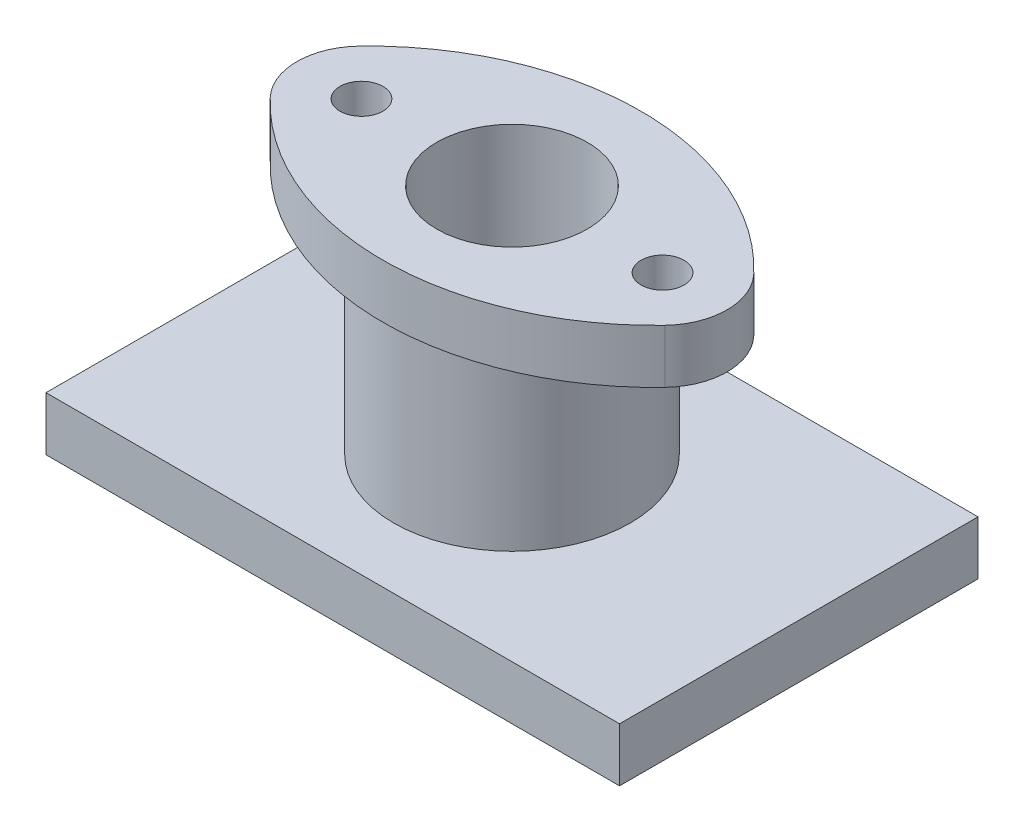
ISO-10303-21;
HEADER;
FILE_DESCRIPTION(('STEP AP214'),'2;1');
FILE_NAME('part.step','',(''),(''),'','','');
FILE_SCHEMA(('AUTOMOTIVE_DESIGN { 1 0 10303 214 1 1 1 1 }'));
ENDSEC;
DATA;
#1=APPLICATION_CONTEXT('core data for automotive mechanical design processes');
#2=APPLICATION_PROTOCOL_DEFINITION('international standard','automotive_design',2000,#1);
#3=PRODUCT_CONTEXT('',#1,'mechanical');
#4=PRODUCT('Part','Part','',(#3));
#5=PRODUCT_RELATED_PRODUCT_CATEGORY('part','',(#4));
#6=PRODUCT_DEFINITION_FORMATION('','',#4);
#7=PRODUCT_DEFINITION_CONTEXT('part definition',#1,'design');
#8=PRODUCT_DEFINITION('design','',#6,#7);
#9=PRODUCT_DEFINITION_SHAPE('','',#8);
#10=(LENGTH_UNIT() NAMED_UNIT(*) SI_UNIT(.MILLI.,.METRE.));
#11=(NAMED_UNIT(*) PLANE_ANGLE_UNIT() SI_UNIT($,.RADIAN.));
#12=(NAMED_UNIT(*) SI_UNIT($,.STERADIAN.) SOLID_ANGLE_UNIT());
#13=UNCERTAINTY_MEASURE_WITH_UNIT(LENGTH_MEASURE(1.E-05),#10,'distance_accuracy_value','');
#14=(GEOMETRIC_REPRESENTATION_CONTEXT(3) GLOBAL_UNCERTAINTY_ASSIGNED_CONTEXT((#13)) GLOBAL_UNIT_ASSIGNED_CONTEXT((#10,
#11,#12)) REPRESENTATION_CONTEXT('',''));
#15=CARTESIAN_POINT('',(0.,0.,0.));
#16=DIRECTION('',(0.,0.,1.));
#17=DIRECTION('',(1.,0.,0.));
#18=AXIS2_PLACEMENT_3D('',#15,#16,#17);
#19=CARTESIAN_POINT('',(80.,15.,-50.));
#20=DIRECTION('',(-1.,0.,0.));
#21=DIRECTION('',(0.,0.,1.));
#22=AXIS2_PLACEMENT_3D('',#19,#20,#21);
#23=PLANE('',#22);
#24=DIRECTION('',(0.,0.,-1.));
#25=VECTOR('',#24,1.);
#26=CARTESIAN_POINT('',(80.,0.,-50.));
#27=LINE('',#26,#25);
#28=CARTESIAN_POINT('',(80.,0.,50.));
#29=VERTEX_POINT('',#28);
#30=CARTESIAN_POINT('',(80.,0.,-50.));
#31=VERTEX_POINT('',#30);
#32=EDGE_CURVE('E152',#29,#31,#27,.T.);
#33=ORIENTED_EDGE('',*,*,#32,.T.);
#34=DIRECTION('',(0.,-1.,0.));
#35=VECTOR('',#34,1.);
#36=CARTESIAN_POINT('',(80.,15.,-50.));
#37=LINE('',#36,#35);
#38=CARTESIAN_POINT('',(80.,15.,-50.));
#39=VERTEX_POINT('',#38);
#40=EDGE_CURVE('E11',#39,#31,#37,.T.);
#41=ORIENTED_EDGE('',*,*,#40,.F.);
#42=DIRECTION('',(0.,0.,-1.));
#43=VECTOR('',#42,1.);
#44=CARTESIAN_POINT('',(80.,15.,-50.));
#45=LINE('',#44,#43);
#46=CARTESIAN_POINT('',(80.,15.,50.));
#47=VERTEX_POINT('',#46);
#48=EDGE_CURVE('E158',#47,#39,#45,.T.);
#49=ORIENTED_EDGE('',*,*,#48,.F.);
#50=DIRECTION('',(0.,-1.,0.));
#51=VECTOR('',#50,1.);
#52=CARTESIAN_POINT('',(80.,15.,50.));
#53=LINE('',#52,#51);
#54=EDGE_CURVE('E164',#47,#29,#53,.T.);
#55=ORIENTED_EDGE('',*,*,#54,.T.);
#56=EDGE_LOOP('',(#33,#41,#49,#55));
#57=FACE_BOUND('',#56,.T.);
#58=ADVANCED_FACE('F38',(#57),#23,.F.);
#59=CARTESIAN_POINT('',(-80.,15.,-50.));
#60=DIRECTION('',(0.,0.,1.));
#61=DIRECTION('',(1.,0.,0.));
#62=AXIS2_PLACEMENT_3D('',#59,#60,#61);
#63=PLANE('',#62);
#64=DIRECTION('',(-1.,0.,0.));
#65=VECTOR('',#64,1.);
#66=CARTESIAN_POINT('',(-80.,0.,-50.));
#67=LINE('',#66,#65);
#68=CARTESIAN_POINT('',(-80.,0.,-50.));
#69=VERTEX_POINT('',#68);
#70=EDGE_CURVE('E167',#31,#69,#67,.T.);
#71=ORIENTED_EDGE('',*,*,#70,.T.);
#72=DIRECTION('',(0.,-1.,0.));
#73=VECTOR('',#72,1.);
#74=CARTESIAN_POINT('',(-80.,15.,-50.));
#75=LINE('',#74,#73);
#76=CARTESIAN_POINT('',(-80.,15.,-50.));
#77=VERTEX_POINT('',#76);
#78=EDGE_CURVE('E46',#77,#69,#75,.T.);
#79=ORIENTED_EDGE('',*,*,#78,.F.);
#80=DIRECTION('',(-1.,0.,0.));
#81=VECTOR('',#80,1.);
#82=CARTESIAN_POINT('',(-80.,15.,-50.));
#83=LINE('',#82,#81);
#84=EDGE_CURVE('E85',#39,#77,#83,.T.);
#85=ORIENTED_EDGE('',*,*,#84,.F.);
#86=ORIENTED_EDGE('',*,*,#40,.T.);
#87=EDGE_LOOP('',(#71,#79,#85,#86));
#88=FACE_BOUND('',#87,.T.);
#89=ADVANCED_FACE('F191',(#88),#63,.F.);
#90=CARTESIAN_POINT('',(-80.,15.,-50.));
#91=DIRECTION('',(1.,0.,0.));
#92=DIRECTION('',(0.,0.,-1.));
#93=AXIS2_PLACEMENT_3D('',#90,#91,#92);
#94=PLANE('',#93);
#95=DIRECTION('',(0.,0.,1.));
#96=VECTOR('',#95,1.);
#97=CARTESIAN_POINT('',(-80.,0.,-50.));
#98=LINE('',#97,#96);
#99=CARTESIAN_POINT('',(-80.,0.,50.));
#100=VERTEX_POINT('',#99);
#101=EDGE_CURVE('E72',#69,#100,#98,.T.);
#102=ORIENTED_EDGE('',*,*,#101,.T.);
#103=DIRECTION('',(0.,-1.,0.));
#104=VECTOR('',#103,1.);
#105=CARTESIAN_POINT('',(-80.,15.,50.));
#106=LINE('',#105,#104);
#107=CARTESIAN_POINT('',(-80.,15.,50.));
#108=VERTEX_POINT('',#107);
#109=EDGE_CURVE('E172',#108,#100,#106,.T.);
#110=ORIENTED_EDGE('',*,*,#109,.F.);
#111=DIRECTION('',(0.,0.,1.));
#112=VECTOR('',#111,1.);
#113=CARTESIAN_POINT('',(-80.,15.,-50.));
#114=LINE('',#113,#112);
#115=EDGE_CURVE('E161',#77,#108,#114,.T.);
#116=ORIENTED_EDGE('',*,*,#115,.F.);
#117=ORIENTED_EDGE('',*,*,#78,.T.);
#118=EDGE_LOOP('',(#102,#110,#116,#117));
#119=FACE_BOUND('',#118,.T.);
#120=ADVANCED_FACE('F174',(#119),#94,.F.);
#121=CARTESIAN_POINT('',(-80.,15.,50.));
#122=DIRECTION('',(0.,0.,-1.));
#123=DIRECTION('',(-1.,0.,0.));
#124=AXIS2_PLACEMENT_3D('',#121,#122,#123);
#125=PLANE('',#124);
#126=DIRECTION('',(1.,0.,0.));
#127=VECTOR('',#126,1.);
#128=CARTESIAN_POINT('',(-80.,0.,50.));
#129=LINE('',#128,#127);
#130=EDGE_CURVE('E78',#100,#29,#129,.T.);
#131=ORIENTED_EDGE('',*,*,#130,.T.);
#132=ORIENTED_EDGE('',*,*,#54,.F.);
#133=DIRECTION('',(1.,0.,0.));
#134=VECTOR('',#133,1.);
#135=CARTESIAN_POINT('',(-80.,15.,50.));
#136=LINE('',#135,#134);
#137=EDGE_CURVE('E54',#108,#47,#136,.T.);
#138=ORIENTED_EDGE('',*,*,#137,.F.);
#139=ORIENTED_EDGE('',*,*,#109,.T.);
#140=EDGE_LOOP('',(#131,#132,#138,#139));
#141=FACE_BOUND('',#140,.T.);
#142=ADVANCED_FACE('F181',(#141),#125,.F.);
#143=CARTESIAN_POINT('',(0.,15.,0.));
#144=DIRECTION('',(0.,1.,0.));
#145=DIRECTION('',(0.,0.,1.));
#146=AXIS2_PLACEMENT_3D('',#143,#144,#145);
#147=PLANE('',#146);
#148=CARTESIAN_POINT('',(0.,15.,0.));
#149=DIRECTION('',(0.,1.,0.));
#150=DIRECTION('',(0.,0.,1.));
#151=AXIS2_PLACEMENT_3D('',#148,#149,#150);
#152=CIRCLE('',#151,33.);
#153=CARTESIAN_POINT('',(0.,15.,33.));
#154=VERTEX_POINT('',#153);
#155=EDGE_CURVE('E138',#154,#154,#152,.T.);
#156=ORIENTED_EDGE('',*,*,#155,.F.);
#157=EDGE_LOOP('',(#156));
#158=FACE_BOUND('',#157,.T.);
#159=ORIENTED_EDGE('',*,*,#48,.T.);
#160=ORIENTED_EDGE('',*,*,#84,.T.);
#161=ORIENTED_EDGE('',*,*,#115,.T.);
#162=ORIENTED_EDGE('',*,*,#137,.T.);
#163=EDGE_LOOP('',(#159,#160,#161,#162));
#164=FACE_BOUND('',#163,.T.);
#165=ADVANCED_FACE('F183',(#158,#164),#147,.T.);
#166=CARTESIAN_POINT('',(0.,0.,0.));
#167=DIRECTION('',(0.,1.,0.));
#168=DIRECTION('',(0.,0.,1.));
#169=AXIS2_PLACEMENT_3D('',#166,#167,#168);
#170=PLANE('',#169);
#171=CARTESIAN_POINT('',(0.,0.,0.));
#172=DIRECTION('',(0.,-1.,0.));
#173=DIRECTION('',(0.,0.,-1.));
#174=AXIS2_PLACEMENT_3D('',#171,#172,#173);
#175=CIRCLE('',#174,16.5);
#176=CARTESIAN_POINT('',(0.,0.,-16.5));
#177=VERTEX_POINT('',#176);
#178=EDGE_CURVE('E148',#177,#177,#175,.T.);
#179=ORIENTED_EDGE('',*,*,#178,.F.);
#180=EDGE_LOOP('',(#179));
#181=FACE_BOUND('',#180,.T.);
#182=ORIENTED_EDGE('',*,*,#32,.F.);
#183=ORIENTED_EDGE('',*,*,#130,.F.);
#184=ORIENTED_EDGE('',*,*,#101,.F.);
#185=ORIENTED_EDGE('',*,*,#70,.F.);
#186=EDGE_LOOP('',(#182,#183,#184,#185));
#187=FACE_BOUND('',#186,.T.);
#188=ADVANCED_FACE('F177',(#181,#187),#170,.F.);
#189=CARTESIAN_POINT('',(0.,61.6690475583121,0.));
#190=DIRECTION('',(0.,-1.,0.));
#191=DIRECTION('',(0.,0.,-1.));
#192=AXIS2_PLACEMENT_3D('',#189,#190,#191);
#193=CYLINDRICAL_SURFACE('',#192,16.5);
#194=CARTESIAN_POINT('',(0.,15.,0.));
#195=DIRECTION('',(0.,1.,0.));
#196=DIRECTION('',(0.,0.,1.));
#197=AXIS2_PLACEMENT_3D('',#194,#195,#196);
#198=CIRCLE('',#197,16.5);
#199=CARTESIAN_POINT('',(0.,15.,-16.5));
#200=VERTEX_POINT('',#199);
#201=EDGE_CURVE('E153',#200,#200,#198,.F.);
#202=CARTESIAN_POINT('',(0.,0.,-16.5));
#203=CARTESIAN_POINT('',(0.,0.156250000000006,-16.5));
#204=CARTESIAN_POINT('',(0.,0.312500000000005,-16.5));
#205=CARTESIAN_POINT('',(0.,0.625000000000005,-16.5));
#206=CARTESIAN_POINT('',(0.,0.781250000000007,-16.5));
#207=CARTESIAN_POINT('',(0.,1.09375000000001,-16.5));
#208=CARTESIAN_POINT('',(0.,1.25000000000001,-16.5));
#209=CARTESIAN_POINT('',(0.,1.56250000000001,-16.5));
#210=CARTESIAN_POINT('',(0.,1.71875000000001,-16.5));
#211=CARTESIAN_POINT('',(0.,2.03125000000001,-16.5));
#212=CARTESIAN_POINT('',(0.,2.18750000000001,-16.5));
#213=CARTESIAN_POINT('',(0.,2.5,-16.5));
#214=CARTESIAN_POINT('',(0.,2.65625,-16.5));
#215=CARTESIAN_POINT('',(0.,2.96875,-16.5));
#216=CARTESIAN_POINT('',(0.,3.125,-16.5));
#217=CARTESIAN_POINT('',(0.,3.43750000000001,-16.5));
#218=CARTESIAN_POINT('',(0.,3.59375,-16.5));
#219=CARTESIAN_POINT('',(0.,3.90625,-16.5));
#220=CARTESIAN_POINT('',(0.,4.0625,-16.5));
#221=CARTESIAN_POINT('',(0.,4.375,-16.5));
#222=CARTESIAN_POINT('',(0.,4.53125,-16.5));
#223=CARTESIAN_POINT('',(0.,4.84375,-16.5));
#224=CARTESIAN_POINT('',(0.,5.,-16.5));
#225=CARTESIAN_POINT('',(0.,5.3125,-16.5));
#226=CARTESIAN_POINT('',(0.,5.46875,-16.5));
#227=CARTESIAN_POINT('',(0.,5.78125,-16.5));
#228=CARTESIAN_POINT('',(0.,5.9375,-16.5));
#229=CARTESIAN_POINT('',(0.,6.25,-16.5));
#230=CARTESIAN_POINT('',(0.,6.40625,-16.5));
#231=CARTESIAN_POINT('',(0.,6.71875,-16.5));
#232=CARTESIAN_POINT('',(0.,6.875,-16.5));
#233=CARTESIAN_POINT('',(0.,7.1875,-16.5));
#234=CARTESIAN_POINT('',(0.,7.34375,-16.5));
#235=CARTESIAN_POINT('',(0.,7.65625,-16.5));
#236=CARTESIAN_POINT('',(0.,7.8125,-16.5));
#237=CARTESIAN_POINT('',(0.,8.125,-16.5));
#238=CARTESIAN_POINT('',(0.,8.28125,-16.5));
#239=CARTESIAN_POINT('',(0.,8.59375,-16.5));
#240=CARTESIAN_POINT('',(0.,8.75,-16.5));
#241=CARTESIAN_POINT('',(0.,9.0625,-16.5));
#242=CARTESIAN_POINT('',(0.,9.21875,-16.5));
#243=CARTESIAN_POINT('',(0.,9.53125,-16.5));
#244=CARTESIAN_POINT('',(0.,9.6875,-16.5));
#245=CARTESIAN_POINT('',(0.,10.,-16.5));
#246=CARTESIAN_POINT('',(0.,10.15625,-16.5));
#247=CARTESIAN_POINT('',(0.,10.46875,-16.5));
#248=CARTESIAN_POINT('',(0.,10.625,-16.5));
#249=CARTESIAN_POINT('',(0.,10.9375,-16.5));
#250=CARTESIAN_POINT('',(0.,11.09375,-16.5));
#251=CARTESIAN_POINT('',(0.,11.40625,-16.5));
#252=CARTESIAN_POINT('',(0.,11.5625,-16.5));
#253=CARTESIAN_POINT('',(0.,11.875,-16.5));
#254=CARTESIAN_POINT('',(0.,12.03125,-16.5));
#255=CARTESIAN_POINT('',(0.,12.34375,-16.5));
#256=CARTESIAN_POINT('',(0.,12.5,-16.5));
#257=CARTESIAN_POINT('',(0.,12.8125,-16.5));
#258=CARTESIAN_POINT('',(0.,12.96875,-16.5));
#259=CARTESIAN_POINT('',(0.,13.28125,-16.5));
#260=CARTESIAN_POINT('',(0.,13.4375,-16.5));
#261=CARTESIAN_POINT('',(0.,13.75,-16.5));
#262=CARTESIAN_POINT('',(0.,13.90625,-16.5));
#263=CARTESIAN_POINT('',(0.,14.21875,-16.5));
#264=CARTESIAN_POINT('',(0.,14.375,-16.5));
#265=CARTESIAN_POINT('',(0.,14.6875,-16.5));
#266=CARTESIAN_POINT('',(0.,14.84375,-16.5));
#267=CARTESIAN_POINT('',(0.,15.,-16.5));
#268=B_SPLINE_CURVE_WITH_KNOTS('',3,(#202,#203,#204,#205,#206,#207,#208,#209,#210,#211,#212,
#213,#214,#215,#216,#217,#218,#219,#220,#221,#222,#223,#224,#225,#226,#227,#228,#229,#230,#231,
#232,#233,#234,#235,#236,#237,#238,#239,#240,#241,#242,#243,#244,#245,#246,#247,#248,#249,#250,
#251,#252,#253,#254,#255,#256,#257,#258,#259,#260,#261,#262,#263,#264,#265,#266,#267),
.UNSPECIFIED.,.F.,.F.,(4,2,2,2,2,2,2,2,2,2,2,2,2,2,2,2,2,2,2,2,2,2,2,2,2,2,2,2,2,2,2,2,4),(0.,
0.468749999999997,0.937500000000001,1.40625,1.875,2.34375,2.8125,3.28125,3.75,4.21874999999999,
4.6875,5.15624999999999,5.62499999999999,6.09374999999999,6.56249999999999,7.03125,
7.49999999999999,7.96875,8.43749999999999,8.90624999999999,9.37499999999999,9.84374999999999,
10.3125,10.78125,11.25,11.71875,12.1875,12.65625,13.125,13.59375,14.0625,14.53125,15.),.UNSPECIFIED.);
#269=EDGE_CURVE('BSEAM218',#177,#200,#268,.T.);
#270=ORIENTED_EDGE('',*,*,#178,.T.);
#271=ORIENTED_EDGE('',*,*,#201,.F.);
#272=ORIENTED_EDGE('',*,*,#269,.T.);
#273=ORIENTED_EDGE('',*,*,#269,.F.);
#274=EDGE_LOOP('',(#270,#272,#271,#273));
#275=FACE_BOUND('',#274,.T.);
#276=ADVANCED_FACE('F218',(#275),#193,.F.);
#277=CARTESIAN_POINT('',(0.,65.,0.));
#278=DIRECTION('',(0.,-1.,0.));
#279=DIRECTION('',(0.,0.,-1.));
#280=AXIS2_PLACEMENT_3D('',#277,#278,#279);
#281=CYLINDRICAL_SURFACE('',#280,33.);
#282=CARTESIAN_POINT('',(0.,65.,0.));
#283=DIRECTION('',(0.,1.,0.));
#284=DIRECTION('',(0.,0.,1.));
#285=AXIS2_PLACEMENT_3D('',#282,#283,#284);
#286=CIRCLE('',#285,33.);
#287=CARTESIAN_POINT('',(0.,65.,33.));
#288=VERTEX_POINT('',#287);
#289=EDGE_CURVE('E141',#288,#288,#286,.T.);
#290=ORIENTED_EDGE('',*,*,#289,.F.);
#291=EDGE_LOOP('',(#290));
#292=FACE_BOUND('',#291,.T.);
#293=ORIENTED_EDGE('',*,*,#155,.T.);
#294=EDGE_LOOP('',(#293));
#295=FACE_BOUND('',#294,.T.);
#296=ADVANCED_FACE('F227',(#292,#295),#281,.T.);
#297=CARTESIAN_POINT('',(21.,80.,20.));
#298=DIRECTION('',(0.,-1.,0.));
#299=DIRECTION('',(0.,0.,-1.));
#300=AXIS2_PLACEMENT_3D('',#297,#298,#299);
#301=PLANE('',#300);
#302=CARTESIAN_POINT('',(0.,80.,0.));
#303=DIRECTION('',(0.,1.,0.));
#304=DIRECTION('',(0.,0.,1.));
#305=AXIS2_PLACEMENT_3D('',#302,#303,#304);
#306=CIRCLE('',#305,21.);
#307=CARTESIAN_POINT('',(0.,80.,21.));
#308=VERTEX_POINT('',#307);
#309=EDGE_CURVE('E346',#308,#308,#306,.T.);
#310=ORIENTED_EDGE('',*,*,#309,.F.);
#311=EDGE_LOOP('',(#310));
#312=FACE_BOUND('',#311,.T.);
#313=CARTESIAN_POINT('',(0.,80.,40.));
#314=DIRECTION('',(0.,1.,0.));
#315=DIRECTION('',(0.,0.,-1.));
#316=AXIS2_PLACEMENT_3D('',#313,#314,#315);
#317=CIRCLE('',#316,76.);
#318=CARTESIAN_POINT('',(55.0344827586207,80.,-12.4137931034483));
#319=VERTEX_POINT('',#318);
#320=CARTESIAN_POINT('',(-55.0344827586207,80.,-12.4137931034483));
#321=VERTEX_POINT('',#320);
#322=EDGE_CURVE('E123',#319,#321,#317,.T.);
#323=ORIENTED_EDGE('',*,*,#322,.T.);
#324=CARTESIAN_POINT('',(-42.,80.,0.));
#325=DIRECTION('',(0.,1.,0.));
#326=DIRECTION('',(0.,0.,1.));
#327=AXIS2_PLACEMENT_3D('',#324,#325,#326);
#328=CIRCLE('',#327,18.);
#329=CARTESIAN_POINT('',(-55.0344827586207,80.,12.4137931034483));
#330=VERTEX_POINT('',#329);
#331=EDGE_CURVE('E112',#321,#330,#328,.T.);
#332=ORIENTED_EDGE('',*,*,#331,.T.);
#333=CARTESIAN_POINT('',(0.,80.,-40.));
#334=DIRECTION('',(0.,1.,0.));
#335=DIRECTION('',(0.,0.,1.));
#336=AXIS2_PLACEMENT_3D('',#333,#334,#335);
#337=CIRCLE('',#336,76.);
#338=CARTESIAN_POINT('',(55.0344827586206,80.,12.4137931034483));
#339=VERTEX_POINT('',#338);
#340=EDGE_CURVE('E122',#330,#339,#337,.T.);
#341=ORIENTED_EDGE('',*,*,#340,.T.);
#342=CARTESIAN_POINT('',(42.,80.,0.));
#343=DIRECTION('',(0.,1.,0.));
#344=DIRECTION('',(0.,0.,-1.));
#345=AXIS2_PLACEMENT_3D('',#342,#343,#344);
#346=CIRCLE('',#345,18.);
#347=EDGE_CURVE('E129',#339,#319,#346,.T.);
#348=ORIENTED_EDGE('',*,*,#347,.T.);
#349=EDGE_LOOP('',(#323,#332,#341,#348));
#350=FACE_BOUND('',#349,.T.);
#351=CARTESIAN_POINT('',(-42.,80.,0.));
#352=DIRECTION('',(0.,1.,0.));
#353=DIRECTION('',(0.,0.,1.));
#354=AXIS2_PLACEMENT_3D('',#351,#352,#353);
#355=CIRCLE('',#354,6.);
#356=CARTESIAN_POINT('',(-42.,80.,6.00000000000001));
#357=VERTEX_POINT('',#356);
#358=EDGE_CURVE('E356',#357,#357,#355,.T.);
#359=ORIENTED_EDGE('',*,*,#358,.F.);
#360=EDGE_LOOP('',(#359));
#361=FACE_BOUND('',#360,.T.);
#362=CARTESIAN_POINT('',(42.,80.,0.));
#363=DIRECTION('',(0.,1.,0.));
#364=DIRECTION('',(0.,0.,1.));
#365=AXIS2_PLACEMENT_3D('',#362,#363,#364);
#366=CIRCLE('',#365,6.00000000000001);
#367=CARTESIAN_POINT('',(42.,80.,6.00000000000001));
#368=VERTEX_POINT('',#367);
#369=EDGE_CURVE('E350',#368,#368,#366,.T.);
#370=ORIENTED_EDGE('',*,*,#369,.F.);
#371=EDGE_LOOP('',(#370));
#372=FACE_BOUND('',#371,.T.);
#373=ADVANCED_FACE('F126',(#312,#350,#361,#372),#301,.F.);
#374=CARTESIAN_POINT('',(21.,65.,20.));
#375=DIRECTION('',(0.,-1.,0.));
#376=DIRECTION('',(0.,0.,-1.));
#377=AXIS2_PLACEMENT_3D('',#374,#375,#376);
#378=PLANE('',#377);
#379=ORIENTED_EDGE('',*,*,#289,.T.);
#380=EDGE_LOOP('',(#379));
#381=FACE_BOUND('',#380,.T.);
#382=CARTESIAN_POINT('',(-42.,65.,0.));
#383=DIRECTION('',(0.,1.,0.));
#384=DIRECTION('',(0.,0.,1.));
#385=AXIS2_PLACEMENT_3D('',#382,#383,#384);
#386=CIRCLE('',#385,6.);
#387=CARTESIAN_POINT('',(-42.,65.,6.00000000000001));
#388=VERTEX_POINT('',#387);
#389=EDGE_CURVE('E353',#388,#388,#386,.T.);
#390=ORIENTED_EDGE('',*,*,#389,.T.);
#391=EDGE_LOOP('',(#390));
#392=FACE_BOUND('',#391,.T.);
#393=CARTESIAN_POINT('',(0.,65.,40.));
#394=DIRECTION('',(0.,1.,0.));
#395=DIRECTION('',(0.,0.,-1.));
#396=AXIS2_PLACEMENT_3D('',#393,#394,#395);
#397=CIRCLE('',#396,76.);
#398=CARTESIAN_POINT('',(55.0344827586207,65.,-12.4137931034483));
#399=VERTEX_POINT('',#398);
#400=CARTESIAN_POINT('',(-55.0344827586207,65.,-12.4137931034483));
#401=VERTEX_POINT('',#400);
#402=EDGE_CURVE('E137',#399,#401,#397,.T.);
#403=ORIENTED_EDGE('',*,*,#402,.F.);
#404=CARTESIAN_POINT('',(42.,65.,0.));
#405=DIRECTION('',(0.,1.,0.));
#406=DIRECTION('',(0.,0.,-1.));
#407=AXIS2_PLACEMENT_3D('',#404,#405,#406);
#408=CIRCLE('',#407,18.);
#409=CARTESIAN_POINT('',(55.0344827586206,65.,12.4137931034483));
#410=VERTEX_POINT('',#409);
#411=EDGE_CURVE('E133',#410,#399,#408,.T.);
#412=ORIENTED_EDGE('',*,*,#411,.F.);
#413=CARTESIAN_POINT('',(0.,65.,-40.));
#414=DIRECTION('',(0.,1.,0.));
#415=DIRECTION('',(0.,0.,1.));
#416=AXIS2_PLACEMENT_3D('',#413,#414,#415);
#417=CIRCLE('',#416,76.);
#418=CARTESIAN_POINT('',(-55.0344827586207,65.,12.4137931034483));
#419=VERTEX_POINT('',#418);
#420=EDGE_CURVE('E367',#419,#410,#417,.T.);
#421=ORIENTED_EDGE('',*,*,#420,.F.);
#422=CARTESIAN_POINT('',(-42.,65.,0.));
#423=DIRECTION('',(0.,1.,0.));
#424=DIRECTION('',(0.,0.,1.));
#425=AXIS2_PLACEMENT_3D('',#422,#423,#424);
#426=CIRCLE('',#425,18.);
#427=EDGE_CURVE('E365',#401,#419,#426,.T.);
#428=ORIENTED_EDGE('',*,*,#427,.F.);
#429=EDGE_LOOP('',(#403,#412,#421,#428));
#430=FACE_BOUND('',#429,.T.);
#431=CARTESIAN_POINT('',(42.,65.,0.));
#432=DIRECTION('',(0.,1.,0.));
#433=DIRECTION('',(0.,0.,1.));
#434=AXIS2_PLACEMENT_3D('',#431,#432,#433);
#435=CIRCLE('',#434,6.00000000000001);
#436=CARTESIAN_POINT('',(42.,65.,6.00000000000001));
#437=VERTEX_POINT('',#436);
#438=EDGE_CURVE('E156',#437,#437,#435,.T.);
#439=ORIENTED_EDGE('',*,*,#438,.T.);
#440=EDGE_LOOP('',(#439));
#441=FACE_BOUND('',#440,.T.);
#442=ADVANCED_FACE('F249',(#381,#392,#430,#441),#378,.T.);
#443=CARTESIAN_POINT('',(0.,80.,40.));
#444=DIRECTION('',(0.,-1.,0.));
#445=DIRECTION('',(0.,0.,-1.));
#446=AXIS2_PLACEMENT_3D('',#443,#444,#445);
#447=CYLINDRICAL_SURFACE('',#446,76.);
#448=ORIENTED_EDGE('',*,*,#402,.T.);
#449=DIRECTION('',(0.,-1.,0.));
#450=VECTOR('',#449,1.);
#451=CARTESIAN_POINT('',(-55.0344827586207,80.,-12.4137931034483));
#452=LINE('',#451,#450);
#453=EDGE_CURVE('E116',#321,#401,#452,.T.);
#454=ORIENTED_EDGE('',*,*,#453,.F.);
#455=ORIENTED_EDGE('',*,*,#322,.F.);
#456=DIRECTION('',(0.,-1.,0.));
#457=VECTOR('',#456,1.);
#458=CARTESIAN_POINT('',(55.0344827586207,80.,-12.4137931034483));
#459=LINE('',#458,#457);
#460=EDGE_CURVE('E363',#319,#399,#459,.T.);
#461=ORIENTED_EDGE('',*,*,#460,.T.);
#462=EDGE_LOOP('',(#448,#454,#455,#461));
#463=FACE_BOUND('',#462,.T.);
#464=ADVANCED_FACE('F135',(#463),#447,.T.);
#465=CARTESIAN_POINT('',(-42.,80.,0.));
#466=DIRECTION('',(0.,-1.,0.));
#467=DIRECTION('',(0.,0.,-1.));
#468=AXIS2_PLACEMENT_3D('',#465,#466,#467);
#469=CYLINDRICAL_SURFACE('',#468,18.);
#470=ORIENTED_EDGE('',*,*,#427,.T.);
#471=DIRECTION('',(0.,-1.,0.));
#472=VECTOR('',#471,1.);
#473=CARTESIAN_POINT('',(-55.0344827586207,80.,12.4137931034483));
#474=LINE('',#473,#472);
#475=EDGE_CURVE('E119',#330,#419,#474,.T.);
#476=ORIENTED_EDGE('',*,*,#475,.F.);
#477=ORIENTED_EDGE('',*,*,#331,.F.);
#478=ORIENTED_EDGE('',*,*,#453,.T.);
#479=EDGE_LOOP('',(#470,#476,#477,#478));
#480=FACE_BOUND('',#479,.T.);
#481=ADVANCED_FACE('F114',(#480),#469,.T.);
#482=CARTESIAN_POINT('',(0.,80.,-40.));
#483=DIRECTION('',(0.,-1.,0.));
#484=DIRECTION('',(0.,0.,-1.));
#485=AXIS2_PLACEMENT_3D('',#482,#483,#484);
#486=CYLINDRICAL_SURFACE('',#485,76.);
#487=ORIENTED_EDGE('',*,*,#420,.T.);
#488=DIRECTION('',(0.,-1.,0.));
#489=VECTOR('',#488,1.);
#490=CARTESIAN_POINT('',(55.0344827586206,80.,12.4137931034483));
#491=LINE('',#490,#489);
#492=EDGE_CURVE('E143',#339,#410,#491,.T.);
#493=ORIENTED_EDGE('',*,*,#492,.F.);
#494=ORIENTED_EDGE('',*,*,#340,.F.);
#495=ORIENTED_EDGE('',*,*,#475,.T.);
#496=EDGE_LOOP('',(#487,#493,#494,#495));
#497=FACE_BOUND('',#496,.T.);
#498=ADVANCED_FACE('F271',(#497),#486,.T.);
#499=CARTESIAN_POINT('',(42.,80.,0.));
#500=DIRECTION('',(0.,-1.,0.));
#501=DIRECTION('',(0.,0.,-1.));
#502=AXIS2_PLACEMENT_3D('',#499,#500,#501);
#503=CYLINDRICAL_SURFACE('',#502,18.);
#504=ORIENTED_EDGE('',*,*,#411,.T.);
#505=ORIENTED_EDGE('',*,*,#460,.F.);
#506=ORIENTED_EDGE('',*,*,#347,.F.);
#507=ORIENTED_EDGE('',*,*,#492,.T.);
#508=EDGE_LOOP('',(#504,#505,#506,#507));
#509=FACE_BOUND('',#508,.T.);
#510=ADVANCED_FACE('F280',(#509),#503,.T.);
#511=CARTESIAN_POINT('',(-42.,80.,0.));
#512=DIRECTION('',(0.,-1.,0.));
#513=DIRECTION('',(0.,0.,-1.));
#514=AXIS2_PLACEMENT_3D('',#511,#512,#513);
#515=CYLINDRICAL_SURFACE('',#514,6.);
#516=ORIENTED_EDGE('',*,*,#358,.T.);
#517=EDGE_LOOP('',(#516));
#518=FACE_BOUND('',#517,.T.);
#519=ORIENTED_EDGE('',*,*,#389,.F.);
#520=EDGE_LOOP('',(#519));
#521=FACE_BOUND('',#520,.T.);
#522=ADVANCED_FACE('F290',(#518,#521),#515,.F.);
#523=CARTESIAN_POINT('',(42.,80.,0.));
#524=DIRECTION('',(0.,-1.,0.));
#525=DIRECTION('',(0.,0.,-1.));
#526=AXIS2_PLACEMENT_3D('',#523,#524,#525);
#527=CYLINDRICAL_SURFACE('',#526,6.00000000000001);
#528=ORIENTED_EDGE('',*,*,#369,.T.);
#529=EDGE_LOOP('',(#528));
#530=FACE_BOUND('',#529,.T.);
#531=ORIENTED_EDGE('',*,*,#438,.F.);
#532=EDGE_LOOP('',(#531));
#533=FACE_BOUND('',#532,.T.);
#534=ADVANCED_FACE('F300',(#530,#533),#527,.F.);
#535=CARTESIAN_POINT('',(0.,15.,0.));
#536=DIRECTION('',(0.,1.,0.));
#537=DIRECTION('',(0.,0.,1.));
#538=AXIS2_PLACEMENT_3D('',#535,#536,#537);
#539=PLANE('',#538);
#540=CARTESIAN_POINT('',(0.,15.,0.));
#541=DIRECTION('',(0.,1.,0.));
#542=DIRECTION('',(0.,0.,1.));
#543=AXIS2_PLACEMENT_3D('',#540,#541,#542);
#544=CIRCLE('',#543,21.);
#545=CARTESIAN_POINT('',(0.,15.,21.));
#546=VERTEX_POINT('',#545);
#547=EDGE_CURVE('E157',#546,#546,#544,.F.);
#548=ORIENTED_EDGE('',*,*,#547,.F.);
#549=EDGE_LOOP('',(#548));
#550=FACE_BOUND('',#549,.T.);
#551=ORIENTED_EDGE('',*,*,#201,.T.);
#552=EDGE_LOOP('',(#551));
#553=FACE_BOUND('',#552,.T.);
#554=ADVANCED_FACE('F310',(#550,#553),#539,.T.);
#555=CARTESIAN_POINT('',(0.,-44.39696961967,0.));
#556=DIRECTION('',(0.,1.,0.));
#557=DIRECTION('',(0.,0.,1.));
#558=AXIS2_PLACEMENT_3D('',#555,#556,#557);
#559=CYLINDRICAL_SURFACE('',#558,21.);
#560=ORIENTED_EDGE('',*,*,#547,.T.);
#561=EDGE_LOOP('',(#560));
#562=FACE_BOUND('',#561,.T.);
#563=ORIENTED_EDGE('',*,*,#309,.T.);
#564=EDGE_LOOP('',(#563));
#565=FACE_BOUND('',#564,.T.);
#566=ADVANCED_FACE('F327',(#562,#565),#559,.F.);
#567=CLOSED_SHELL('',(#58,#89,#120,#142,#165,#188,#276,#296,#373,#442,#464,#481,#498,#510,#522,
#534,#554,#566));
#568=MANIFOLD_SOLID_BREP('B2',#567);
#569=ADVANCED_BREP_SHAPE_REPRESENTATION('',(#18,#568),#14);
#570=SHAPE_DEFINITION_REPRESENTATION(#9,#569);
ENDSEC;
END-ISO-10303-21;
